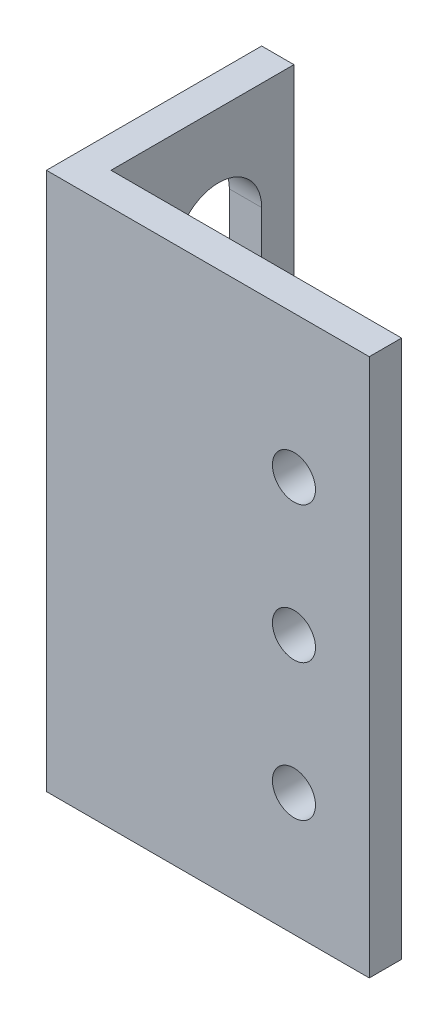
ISO-10303-21;
HEADER;
FILE_DESCRIPTION(('STEP AP214'),'2;1');
FILE_NAME('part.step','',(''),(''),'','','');
FILE_SCHEMA(('AUTOMOTIVE_DESIGN { 1 0 10303 214 1 1 1 1 }'));
ENDSEC;
DATA;
#1=APPLICATION_CONTEXT('core data for automotive mechanical design processes');
#2=APPLICATION_PROTOCOL_DEFINITION('international standard','automotive_design',2000,#1);
#3=PRODUCT_CONTEXT('',#1,'mechanical');
#4=PRODUCT('Part','Part','',(#3));
#5=PRODUCT_RELATED_PRODUCT_CATEGORY('part','',(#4));
#6=PRODUCT_DEFINITION_FORMATION('','',#4);
#7=PRODUCT_DEFINITION_CONTEXT('part definition',#1,'design');
#8=PRODUCT_DEFINITION('design','',#6,#7);
#9=PRODUCT_DEFINITION_SHAPE('','',#8);
#10=(LENGTH_UNIT() NAMED_UNIT(*) SI_UNIT(.MILLI.,.METRE.));
#11=(NAMED_UNIT(*) PLANE_ANGLE_UNIT() SI_UNIT($,.RADIAN.));
#12=(NAMED_UNIT(*) SI_UNIT($,.STERADIAN.) SOLID_ANGLE_UNIT());
#13=UNCERTAINTY_MEASURE_WITH_UNIT(LENGTH_MEASURE(1.E-05),#10,'distance_accuracy_value','');
#14=(GEOMETRIC_REPRESENTATION_CONTEXT(3) GLOBAL_UNCERTAINTY_ASSIGNED_CONTEXT((#13)) GLOBAL_UNIT_ASSIGNED_CONTEXT((#10,
#11,#12)) REPRESENTATION_CONTEXT('',''));
#15=CARTESIAN_POINT('',(0.,0.,0.));
#16=DIRECTION('',(0.,0.,1.));
#17=DIRECTION('',(1.,0.,0.));
#18=AXIS2_PLACEMENT_3D('',#15,#16,#17);
#19=CARTESIAN_POINT('',(-1.5,50.,0.));
#20=DIRECTION('',(1.,0.,0.));
#21=DIRECTION('',(0.,0.,-1.));
#22=AXIS2_PLACEMENT_3D('',#19,#20,#21);
#23=PLANE('',#22);
#24=DIRECTION('',(0.,-1.,0.));
#25=VECTOR('',#24,1.);
#26=CARTESIAN_POINT('',(-1.5,40.,-7.00000000000001));
#27=LINE('',#26,#25);
#28=CARTESIAN_POINT('',(-1.5,40.,-7.00000000000001));
#29=VERTEX_POINT('',#28);
#30=CARTESIAN_POINT('',(-1.5,10.,-7.00000000000001));
#31=VERTEX_POINT('',#30);
#32=EDGE_CURVE('E128',#29,#31,#27,.T.);
#33=ORIENTED_EDGE('',*,*,#32,.F.);
#34=CARTESIAN_POINT('',(-1.5,40.,-3.));
#35=DIRECTION('',(-1.,0.,0.));
#36=DIRECTION('',(0.,0.,1.));
#37=AXIS2_PLACEMENT_3D('',#34,#35,#36);
#38=CIRCLE('',#37,4.);
#39=CARTESIAN_POINT('',(-1.5,40.,0.999999999999999));
#40=VERTEX_POINT('',#39);
#41=EDGE_CURVE('E55',#40,#29,#38,.T.);
#42=ORIENTED_EDGE('',*,*,#41,.F.);
#43=DIRECTION('',(0.,1.,0.));
#44=VECTOR('',#43,1.);
#45=CARTESIAN_POINT('',(-1.5,40.,0.999999999999999));
#46=LINE('',#45,#44);
#47=CARTESIAN_POINT('',(-1.5,10.,0.999999999999999));
#48=VERTEX_POINT('',#47);
#49=EDGE_CURVE('E134',#48,#40,#46,.T.);
#50=ORIENTED_EDGE('',*,*,#49,.F.);
#51=CARTESIAN_POINT('',(-1.5,10.,-3.));
#52=DIRECTION('',(-1.,0.,0.));
#53=DIRECTION('',(0.,0.,1.));
#54=AXIS2_PLACEMENT_3D('',#51,#52,#53);
#55=CIRCLE('',#54,4.);
#56=EDGE_CURVE('E119',#31,#48,#55,.T.);
#57=ORIENTED_EDGE('',*,*,#56,.F.);
#58=EDGE_LOOP('',(#33,#42,#50,#57));
#59=FACE_BOUND('',#58,.T.);
#60=DIRECTION('',(0.,0.,1.));
#61=VECTOR('',#60,1.);
#62=CARTESIAN_POINT('',(-1.5,0.,0.));
#63=LINE('',#62,#61);
#64=CARTESIAN_POINT('',(-1.5,0.,-10.));
#65=VERTEX_POINT('',#64);
#66=CARTESIAN_POINT('',(-1.5,0.,10.));
#67=VERTEX_POINT('',#66);
#68=EDGE_CURVE('E171',#65,#67,#63,.T.);
#69=ORIENTED_EDGE('',*,*,#68,.T.);
#70=DIRECTION('',(0.,-1.,0.));
#71=VECTOR('',#70,1.);
#72=CARTESIAN_POINT('',(-1.5,50.,10.));
#73=LINE('',#72,#71);
#74=CARTESIAN_POINT('',(-1.5,50.,10.));
#75=VERTEX_POINT('',#74);
#76=EDGE_CURVE('E198',#75,#67,#73,.T.);
#77=ORIENTED_EDGE('',*,*,#76,.F.);
#78=DIRECTION('',(0.,0.,1.));
#79=VECTOR('',#78,1.);
#80=CARTESIAN_POINT('',(-1.5,50.,0.));
#81=LINE('',#80,#79);
#82=CARTESIAN_POINT('',(-1.5,50.,-10.));
#83=VERTEX_POINT('',#82);
#84=EDGE_CURVE('E153',#83,#75,#81,.T.);
#85=ORIENTED_EDGE('',*,*,#84,.F.);
#86=DIRECTION('',(0.,-1.,0.));
#87=VECTOR('',#86,1.);
#88=CARTESIAN_POINT('',(-1.5,50.,-10.));
#89=LINE('',#88,#87);
#90=EDGE_CURVE('E170',#83,#65,#89,.T.);
#91=ORIENTED_EDGE('',*,*,#90,.T.);
#92=EDGE_LOOP('',(#69,#77,#85,#91));
#93=FACE_BOUND('',#92,.T.);
#94=ADVANCED_FACE('F41',(#59,#93),#23,.F.);
#95=CARTESIAN_POINT('',(0.,50.,10.));
#96=DIRECTION('',(0.,0.,-1.));
#97=DIRECTION('',(-1.,0.,0.));
#98=AXIS2_PLACEMENT_3D('',#95,#96,#97);
#99=PLANE('',#98);
#100=CARTESIAN_POINT('',(21.5,36.8,10.));
#101=DIRECTION('',(0.,0.,1.));
#102=DIRECTION('',(1.,0.,0.));
#103=AXIS2_PLACEMENT_3D('',#100,#101,#102);
#104=CIRCLE('',#103,2.);
#105=CARTESIAN_POINT('',(23.5,36.8,10.));
#106=VERTEX_POINT('',#105);
#107=EDGE_CURVE('E144',#106,#106,#104,.T.);
#108=ORIENTED_EDGE('',*,*,#107,.F.);
#109=EDGE_LOOP('',(#108));
#110=FACE_BOUND('',#109,.T.);
#111=CARTESIAN_POINT('',(21.5000000000001,24.1,10.));
#112=DIRECTION('',(0.,0.,1.));
#113=DIRECTION('',(1.,0.,0.));
#114=AXIS2_PLACEMENT_3D('',#111,#112,#113);
#115=CIRCLE('',#114,2.);
#116=CARTESIAN_POINT('',(23.5000000000001,24.1,10.));
#117=VERTEX_POINT('',#116);
#118=EDGE_CURVE('E148',#117,#117,#115,.T.);
#119=ORIENTED_EDGE('',*,*,#118,.F.);
#120=EDGE_LOOP('',(#119));
#121=FACE_BOUND('',#120,.T.);
#122=CARTESIAN_POINT('',(21.5000000000003,11.4,10.));
#123=DIRECTION('',(0.,0.,1.));
#124=DIRECTION('',(1.,0.,0.));
#125=AXIS2_PLACEMENT_3D('',#122,#123,#124);
#126=CIRCLE('',#125,2.);
#127=CARTESIAN_POINT('',(23.5000000000003,11.4,10.));
#128=VERTEX_POINT('',#127);
#129=EDGE_CURVE('E141',#128,#128,#126,.T.);
#130=ORIENTED_EDGE('',*,*,#129,.F.);
#131=EDGE_LOOP('',(#130));
#132=FACE_BOUND('',#131,.T.);
#133=DIRECTION('',(1.,0.,0.));
#134=VECTOR('',#133,1.);
#135=CARTESIAN_POINT('',(0.,0.,10.));
#136=LINE('',#135,#134);
#137=CARTESIAN_POINT('',(28.5,0.,10.));
#138=VERTEX_POINT('',#137);
#139=EDGE_CURVE('E174',#67,#138,#136,.T.);
#140=ORIENTED_EDGE('',*,*,#139,.T.);
#141=DIRECTION('',(0.,-1.,0.));
#142=VECTOR('',#141,1.);
#143=CARTESIAN_POINT('',(28.5,50.,10.));
#144=LINE('',#143,#142);
#145=CARTESIAN_POINT('',(28.5,50.,10.));
#146=VERTEX_POINT('',#145);
#147=EDGE_CURVE('E195',#146,#138,#144,.T.);
#148=ORIENTED_EDGE('',*,*,#147,.F.);
#149=DIRECTION('',(1.,0.,0.));
#150=VECTOR('',#149,1.);
#151=CARTESIAN_POINT('',(0.,50.,10.));
#152=LINE('',#151,#150);
#153=EDGE_CURVE('E156',#75,#146,#152,.T.);
#154=ORIENTED_EDGE('',*,*,#153,.F.);
#155=ORIENTED_EDGE('',*,*,#76,.T.);
#156=EDGE_LOOP('',(#140,#148,#154,#155));
#157=FACE_BOUND('',#156,.T.);
#158=ADVANCED_FACE('F233',(#110,#121,#132,#157),#99,.F.);
#159=CARTESIAN_POINT('',(28.5,50.,0.));
#160=DIRECTION('',(-1.,0.,0.));
#161=DIRECTION('',(0.,0.,1.));
#162=AXIS2_PLACEMENT_3D('',#159,#160,#161);
#163=PLANE('',#162);
#164=DIRECTION('',(0.,0.,-1.));
#165=VECTOR('',#164,1.);
#166=CARTESIAN_POINT('',(28.5,0.,0.));
#167=LINE('',#166,#165);
#168=CARTESIAN_POINT('',(28.5,0.,7.));
#169=VERTEX_POINT('',#168);
#170=EDGE_CURVE('E177',#138,#169,#167,.T.);
#171=ORIENTED_EDGE('',*,*,#170,.T.);
#172=DIRECTION('',(0.,-1.,0.));
#173=VECTOR('',#172,1.);
#174=CARTESIAN_POINT('',(28.5,50.,7.));
#175=LINE('',#174,#173);
#176=CARTESIAN_POINT('',(28.5,50.,7.));
#177=VERTEX_POINT('',#176);
#178=EDGE_CURVE('E193',#177,#169,#175,.T.);
#179=ORIENTED_EDGE('',*,*,#178,.F.);
#180=DIRECTION('',(0.,0.,-1.));
#181=VECTOR('',#180,1.);
#182=CARTESIAN_POINT('',(28.5,50.,0.));
#183=LINE('',#182,#181);
#184=EDGE_CURVE('E159',#146,#177,#183,.T.);
#185=ORIENTED_EDGE('',*,*,#184,.F.);
#186=ORIENTED_EDGE('',*,*,#147,.T.);
#187=EDGE_LOOP('',(#171,#179,#185,#186));
#188=FACE_BOUND('',#187,.T.);
#189=ADVANCED_FACE('F237',(#188),#163,.F.);
#190=CARTESIAN_POINT('',(0.,50.,7.));
#191=DIRECTION('',(0.,0.,-1.));
#192=DIRECTION('',(-1.,0.,0.));
#193=AXIS2_PLACEMENT_3D('',#190,#191,#192);
#194=PLANE('',#193);
#195=CARTESIAN_POINT('',(21.5,36.8,7.));
#196=DIRECTION('',(0.,0.,-1.));
#197=DIRECTION('',(-1.,0.,0.));
#198=AXIS2_PLACEMENT_3D('',#195,#196,#197);
#199=CIRCLE('',#198,2.);
#200=CARTESIAN_POINT('',(19.5,36.8,7.));
#201=VERTEX_POINT('',#200);
#202=EDGE_CURVE('E175',#201,#201,#199,.T.);
#203=ORIENTED_EDGE('',*,*,#202,.F.);
#204=EDGE_LOOP('',(#203));
#205=FACE_BOUND('',#204,.T.);
#206=CARTESIAN_POINT('',(21.5000000000001,24.1,7.));
#207=DIRECTION('',(0.,0.,-1.));
#208=DIRECTION('',(-1.,0.,0.));
#209=AXIS2_PLACEMENT_3D('',#206,#207,#208);
#210=CIRCLE('',#209,2.);
#211=CARTESIAN_POINT('',(19.5000000000001,24.1,7.));
#212=VERTEX_POINT('',#211);
#213=EDGE_CURVE('E204',#212,#212,#210,.T.);
#214=ORIENTED_EDGE('',*,*,#213,.F.);
#215=EDGE_LOOP('',(#214));
#216=FACE_BOUND('',#215,.T.);
#217=CARTESIAN_POINT('',(21.5000000000003,11.4,7.));
#218=DIRECTION('',(0.,0.,-1.));
#219=DIRECTION('',(-1.,0.,0.));
#220=AXIS2_PLACEMENT_3D('',#217,#218,#219);
#221=CIRCLE('',#220,2.);
#222=CARTESIAN_POINT('',(19.5000000000003,11.4,7.));
#223=VERTEX_POINT('',#222);
#224=EDGE_CURVE('E147',#223,#223,#221,.T.);
#225=ORIENTED_EDGE('',*,*,#224,.F.);
#226=EDGE_LOOP('',(#225));
#227=FACE_BOUND('',#226,.T.);
#228=DIRECTION('',(1.,0.,0.));
#229=VECTOR('',#228,1.);
#230=CARTESIAN_POINT('',(0.,0.,7.));
#231=LINE('',#230,#229);
#232=CARTESIAN_POINT('',(1.5,0.,7.));
#233=VERTEX_POINT('',#232);
#234=EDGE_CURVE('E180',#233,#169,#231,.T.);
#235=ORIENTED_EDGE('',*,*,#234,.F.);
#236=DIRECTION('',(0.,-1.,0.));
#237=VECTOR('',#236,1.);
#238=CARTESIAN_POINT('',(1.5,50.,7.));
#239=LINE('',#238,#237);
#240=CARTESIAN_POINT('',(1.5,50.,7.));
#241=VERTEX_POINT('',#240);
#242=EDGE_CURVE('E191',#241,#233,#239,.T.);
#243=ORIENTED_EDGE('',*,*,#242,.F.);
#244=DIRECTION('',(1.,0.,0.));
#245=VECTOR('',#244,1.);
#246=CARTESIAN_POINT('',(0.,50.,7.));
#247=LINE('',#246,#245);
#248=EDGE_CURVE('E161',#241,#177,#247,.T.);
#249=ORIENTED_EDGE('',*,*,#248,.T.);
#250=ORIENTED_EDGE('',*,*,#178,.T.);
#251=EDGE_LOOP('',(#235,#243,#249,#250));
#252=FACE_BOUND('',#251,.T.);
#253=ADVANCED_FACE('F244',(#205,#216,#227,#252),#194,.T.);
#254=CARTESIAN_POINT('',(1.5,50.,0.));
#255=DIRECTION('',(1.,0.,0.));
#256=DIRECTION('',(0.,0.,-1.));
#257=AXIS2_PLACEMENT_3D('',#254,#255,#256);
#258=PLANE('',#257);
#259=CARTESIAN_POINT('',(1.5,40.,-3.));
#260=DIRECTION('',(1.,0.,0.));
#261=DIRECTION('',(0.,0.,-1.));
#262=AXIS2_PLACEMENT_3D('',#259,#260,#261);
#263=CIRCLE('',#262,4.);
#264=CARTESIAN_POINT('',(1.5,40.,-7.00000000000001));
#265=VERTEX_POINT('',#264);
#266=CARTESIAN_POINT('',(1.5,40.,0.999999999999999));
#267=VERTEX_POINT('',#266);
#268=EDGE_CURVE('E11',#265,#267,#263,.T.);
#269=ORIENTED_EDGE('',*,*,#268,.F.);
#270=DIRECTION('',(0.,1.,0.));
#271=VECTOR('',#270,1.);
#272=CARTESIAN_POINT('',(1.5,50.,-7.00000000000001));
#273=LINE('',#272,#271);
#274=CARTESIAN_POINT('',(1.5,10.,-7.00000000000001));
#275=VERTEX_POINT('',#274);
#276=EDGE_CURVE('E201',#275,#265,#273,.T.);
#277=ORIENTED_EDGE('',*,*,#276,.F.);
#278=CARTESIAN_POINT('',(1.5,10.,-3.));
#279=DIRECTION('',(1.,0.,0.));
#280=DIRECTION('',(0.,0.,-1.));
#281=AXIS2_PLACEMENT_3D('',#278,#279,#280);
#282=CIRCLE('',#281,4.);
#283=CARTESIAN_POINT('',(1.5,10.,0.999999999999999));
#284=VERTEX_POINT('',#283);
#285=EDGE_CURVE('E122',#284,#275,#282,.T.);
#286=ORIENTED_EDGE('',*,*,#285,.F.);
#287=DIRECTION('',(0.,-1.,0.));
#288=VECTOR('',#287,1.);
#289=CARTESIAN_POINT('',(1.5,50.,0.999999999999999));
#290=LINE('',#289,#288);
#291=EDGE_CURVE('E48',#267,#284,#290,.T.);
#292=ORIENTED_EDGE('',*,*,#291,.F.);
#293=EDGE_LOOP('',(#269,#277,#286,#292));
#294=FACE_BOUND('',#293,.T.);
#295=DIRECTION('',(0.,0.,1.));
#296=VECTOR('',#295,1.);
#297=CARTESIAN_POINT('',(1.5,0.,0.));
#298=LINE('',#297,#296);
#299=CARTESIAN_POINT('',(1.5,0.,-10.));
#300=VERTEX_POINT('',#299);
#301=EDGE_CURVE('E183',#300,#233,#298,.T.);
#302=ORIENTED_EDGE('',*,*,#301,.F.);
#303=DIRECTION('',(0.,-1.,0.));
#304=VECTOR('',#303,1.);
#305=CARTESIAN_POINT('',(1.5,50.,-10.));
#306=LINE('',#305,#304);
#307=CARTESIAN_POINT('',(1.5,50.,-10.));
#308=VERTEX_POINT('',#307);
#309=EDGE_CURVE('E189',#308,#300,#306,.T.);
#310=ORIENTED_EDGE('',*,*,#309,.F.);
#311=DIRECTION('',(0.,0.,1.));
#312=VECTOR('',#311,1.);
#313=CARTESIAN_POINT('',(1.5,50.,0.));
#314=LINE('',#313,#312);
#315=EDGE_CURVE('E164',#308,#241,#314,.T.);
#316=ORIENTED_EDGE('',*,*,#315,.T.);
#317=ORIENTED_EDGE('',*,*,#242,.T.);
#318=EDGE_LOOP('',(#302,#310,#316,#317));
#319=FACE_BOUND('',#318,.T.);
#320=ADVANCED_FACE('F216',(#294,#319),#258,.T.);
#321=CARTESIAN_POINT('',(0.,50.,-10.));
#322=DIRECTION('',(0.,0.,-1.));
#323=DIRECTION('',(-1.,0.,0.));
#324=AXIS2_PLACEMENT_3D('',#321,#322,#323);
#325=PLANE('',#324);
#326=DIRECTION('',(1.,0.,0.));
#327=VECTOR('',#326,1.);
#328=CARTESIAN_POINT('',(0.,0.,-10.));
#329=LINE('',#328,#327);
#330=EDGE_CURVE('E157',#65,#300,#329,.T.);
#331=ORIENTED_EDGE('',*,*,#330,.F.);
#332=ORIENTED_EDGE('',*,*,#90,.F.);
#333=DIRECTION('',(1.,0.,0.));
#334=VECTOR('',#333,1.);
#335=CARTESIAN_POINT('',(0.,50.,-10.));
#336=LINE('',#335,#334);
#337=EDGE_CURVE('E167',#83,#308,#336,.T.);
#338=ORIENTED_EDGE('',*,*,#337,.T.);
#339=ORIENTED_EDGE('',*,*,#309,.T.);
#340=EDGE_LOOP('',(#331,#332,#338,#339));
#341=FACE_BOUND('',#340,.T.);
#342=ADVANCED_FACE('F253',(#341),#325,.T.);
#343=CARTESIAN_POINT('',(0.,50.,0.));
#344=DIRECTION('',(0.,1.,0.));
#345=DIRECTION('',(0.,0.,1.));
#346=AXIS2_PLACEMENT_3D('',#343,#344,#345);
#347=PLANE('',#346);
#348=ORIENTED_EDGE('',*,*,#84,.T.);
#349=ORIENTED_EDGE('',*,*,#153,.T.);
#350=ORIENTED_EDGE('',*,*,#184,.T.);
#351=ORIENTED_EDGE('',*,*,#248,.F.);
#352=ORIENTED_EDGE('',*,*,#315,.F.);
#353=ORIENTED_EDGE('',*,*,#337,.F.);
#354=EDGE_LOOP('',(#348,#349,#350,#351,#352,#353));
#355=FACE_BOUND('',#354,.T.);
#356=ADVANCED_FACE('F256',(#355),#347,.T.);
#357=CARTESIAN_POINT('',(0.,0.,0.));
#358=DIRECTION('',(0.,1.,0.));
#359=DIRECTION('',(0.,0.,1.));
#360=AXIS2_PLACEMENT_3D('',#357,#358,#359);
#361=PLANE('',#360);
#362=ORIENTED_EDGE('',*,*,#68,.F.);
#363=ORIENTED_EDGE('',*,*,#330,.T.);
#364=ORIENTED_EDGE('',*,*,#301,.T.);
#365=ORIENTED_EDGE('',*,*,#234,.T.);
#366=ORIENTED_EDGE('',*,*,#170,.F.);
#367=ORIENTED_EDGE('',*,*,#139,.F.);
#368=EDGE_LOOP('',(#362,#363,#364,#365,#366,#367));
#369=FACE_BOUND('',#368,.T.);
#370=ADVANCED_FACE('F258',(#369),#361,.F.);
#371=CARTESIAN_POINT('',(21.5000000000003,11.4,0.));
#372=DIRECTION('',(0.,0.,1.));
#373=DIRECTION('',(1.,0.,0.));
#374=AXIS2_PLACEMENT_3D('',#371,#372,#373);
#375=CYLINDRICAL_SURFACE('',#374,2.);
#376=ORIENTED_EDGE('',*,*,#224,.T.);
#377=EDGE_LOOP('',(#376));
#378=FACE_BOUND('',#377,.T.);
#379=ORIENTED_EDGE('',*,*,#129,.T.);
#380=EDGE_LOOP('',(#379));
#381=FACE_BOUND('',#380,.T.);
#382=ADVANCED_FACE('F260',(#378,#381),#375,.F.);
#383=CARTESIAN_POINT('',(21.5000000000001,24.1,0.));
#384=DIRECTION('',(0.,0.,1.));
#385=DIRECTION('',(1.,0.,0.));
#386=AXIS2_PLACEMENT_3D('',#383,#384,#385);
#387=CYLINDRICAL_SURFACE('',#386,2.);
#388=ORIENTED_EDGE('',*,*,#213,.T.);
#389=EDGE_LOOP('',(#388));
#390=FACE_BOUND('',#389,.T.);
#391=ORIENTED_EDGE('',*,*,#118,.T.);
#392=EDGE_LOOP('',(#391));
#393=FACE_BOUND('',#392,.T.);
#394=ADVANCED_FACE('F228',(#390,#393),#387,.F.);
#395=CARTESIAN_POINT('',(21.5,36.8,0.));
#396=DIRECTION('',(0.,0.,1.));
#397=DIRECTION('',(1.,0.,0.));
#398=AXIS2_PLACEMENT_3D('',#395,#396,#397);
#399=CYLINDRICAL_SURFACE('',#398,2.);
#400=ORIENTED_EDGE('',*,*,#202,.T.);
#401=EDGE_LOOP('',(#400));
#402=FACE_BOUND('',#401,.T.);
#403=ORIENTED_EDGE('',*,*,#107,.T.);
#404=EDGE_LOOP('',(#403));
#405=FACE_BOUND('',#404,.T.);
#406=ADVANCED_FACE('F220',(#402,#405),#399,.F.);
#407=CARTESIAN_POINT('',(8.5,40.,-3.));
#408=DIRECTION('',(-1.,0.,0.));
#409=DIRECTION('',(0.,0.,1.));
#410=AXIS2_PLACEMENT_3D('',#407,#408,#409);
#411=CYLINDRICAL_SURFACE('',#410,4.);
#412=ORIENTED_EDGE('',*,*,#268,.T.);
#413=DIRECTION('',(-1.,0.,0.));
#414=VECTOR('',#413,1.);
#415=CARTESIAN_POINT('',(8.5,40.,0.999999999999999));
#416=LINE('',#415,#414);
#417=EDGE_CURVE('E139',#267,#40,#416,.T.);
#418=ORIENTED_EDGE('',*,*,#417,.T.);
#419=ORIENTED_EDGE('',*,*,#41,.T.);
#420=DIRECTION('',(-1.,0.,0.));
#421=VECTOR('',#420,1.);
#422=CARTESIAN_POINT('',(8.5,40.,-7.00000000000001));
#423=LINE('',#422,#421);
#424=EDGE_CURVE('E125',#265,#29,#423,.T.);
#425=ORIENTED_EDGE('',*,*,#424,.F.);
#426=EDGE_LOOP('',(#412,#418,#419,#425));
#427=FACE_BOUND('',#426,.T.);
#428=ADVANCED_FACE('F218',(#427),#411,.F.);
#429=CARTESIAN_POINT('',(8.5,40.,0.999999999999999));
#430=DIRECTION('',(0.,0.,1.));
#431=DIRECTION('',(1.,0.,0.));
#432=AXIS2_PLACEMENT_3D('',#429,#430,#431);
#433=PLANE('',#432);
#434=ORIENTED_EDGE('',*,*,#291,.T.);
#435=DIRECTION('',(-1.,0.,0.));
#436=VECTOR('',#435,1.);
#437=CARTESIAN_POINT('',(8.5,10.,0.999999999999999));
#438=LINE('',#437,#436);
#439=EDGE_CURVE('E124',#284,#48,#438,.T.);
#440=ORIENTED_EDGE('',*,*,#439,.T.);
#441=ORIENTED_EDGE('',*,*,#49,.T.);
#442=ORIENTED_EDGE('',*,*,#417,.F.);
#443=EDGE_LOOP('',(#434,#440,#441,#442));
#444=FACE_BOUND('',#443,.T.);
#445=ADVANCED_FACE('F213',(#444),#433,.F.);
#446=CARTESIAN_POINT('',(8.5,10.,-3.));
#447=DIRECTION('',(-1.,0.,0.));
#448=DIRECTION('',(0.,0.,1.));
#449=AXIS2_PLACEMENT_3D('',#446,#447,#448);
#450=CYLINDRICAL_SURFACE('',#449,4.);
#451=ORIENTED_EDGE('',*,*,#285,.T.);
#452=DIRECTION('',(-1.,0.,0.));
#453=VECTOR('',#452,1.);
#454=CARTESIAN_POINT('',(8.5,10.,-7.00000000000001));
#455=LINE('',#454,#453);
#456=EDGE_CURVE('E63',#275,#31,#455,.T.);
#457=ORIENTED_EDGE('',*,*,#456,.T.);
#458=ORIENTED_EDGE('',*,*,#56,.T.);
#459=ORIENTED_EDGE('',*,*,#439,.F.);
#460=EDGE_LOOP('',(#451,#457,#458,#459));
#461=FACE_BOUND('',#460,.T.);
#462=ADVANCED_FACE('F116',(#461),#450,.F.);
#463=CARTESIAN_POINT('',(8.5,40.,-7.00000000000001));
#464=DIRECTION('',(0.,0.,-1.));
#465=DIRECTION('',(-1.,0.,0.));
#466=AXIS2_PLACEMENT_3D('',#463,#464,#465);
#467=PLANE('',#466);
#468=ORIENTED_EDGE('',*,*,#276,.T.);
#469=ORIENTED_EDGE('',*,*,#424,.T.);
#470=ORIENTED_EDGE('',*,*,#32,.T.);
#471=ORIENTED_EDGE('',*,*,#456,.F.);
#472=EDGE_LOOP('',(#468,#469,#470,#471));
#473=FACE_BOUND('',#472,.T.);
#474=ADVANCED_FACE('F129',(#473),#467,.F.);
#475=CLOSED_SHELL('',(#94,#158,#189,#253,#320,#342,#356,#370,#382,#394,#406,#428,#445,#462,#474));
#476=MANIFOLD_SOLID_BREP('B2',#475);
#477=ADVANCED_BREP_SHAPE_REPRESENTATION('',(#18,#476),#14);
#478=SHAPE_DEFINITION_REPRESENTATION(#9,#477);
ENDSEC;
END-ISO-10303-21;
